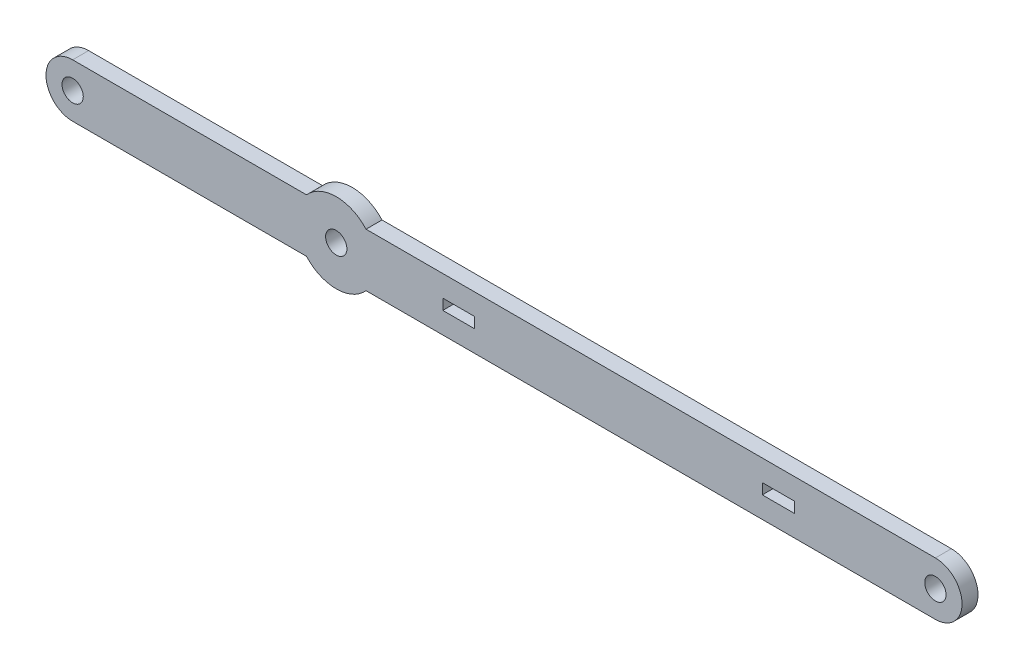
ISO-10303-21;
HEADER;
FILE_DESCRIPTION(('STEP AP214'),'2;1');
FILE_NAME('part.step','',(''),(''),'','','');
FILE_SCHEMA(('AUTOMOTIVE_DESIGN { 1 0 10303 214 1 1 1 1 }'));
ENDSEC;
DATA;
#1=APPLICATION_CONTEXT('core data for automotive mechanical design processes');
#2=APPLICATION_PROTOCOL_DEFINITION('international standard','automotive_design',2000,#1);
#3=PRODUCT_CONTEXT('',#1,'mechanical');
#4=PRODUCT('Part','Part','',(#3));
#5=PRODUCT_RELATED_PRODUCT_CATEGORY('part','',(#4));
#6=PRODUCT_DEFINITION_FORMATION('','',#4);
#7=PRODUCT_DEFINITION_CONTEXT('part definition',#1,'design');
#8=PRODUCT_DEFINITION('design','',#6,#7);
#9=PRODUCT_DEFINITION_SHAPE('','',#8);
#10=(LENGTH_UNIT() NAMED_UNIT(*) SI_UNIT(.MILLI.,.METRE.));
#11=(NAMED_UNIT(*) PLANE_ANGLE_UNIT() SI_UNIT($,.RADIAN.));
#12=(NAMED_UNIT(*) SI_UNIT($,.STERADIAN.) SOLID_ANGLE_UNIT());
#13=UNCERTAINTY_MEASURE_WITH_UNIT(LENGTH_MEASURE(1.E-05),#10,'distance_accuracy_value','');
#14=(GEOMETRIC_REPRESENTATION_CONTEXT(3) GLOBAL_UNCERTAINTY_ASSIGNED_CONTEXT((#13)) GLOBAL_UNIT_ASSIGNED_CONTEXT((#10,
#11,#12)) REPRESENTATION_CONTEXT('',''));
#15=CARTESIAN_POINT('',(0.,0.,0.));
#16=DIRECTION('',(0.,0.,1.));
#17=DIRECTION('',(1.,0.,0.));
#18=AXIS2_PLACEMENT_3D('',#15,#16,#17);
#19=CARTESIAN_POINT('',(0.,0.,1.5));
#20=DIRECTION('',(0.,0.,1.));
#21=DIRECTION('',(1.,0.,0.));
#22=AXIS2_PLACEMENT_3D('',#19,#20,#21);
#23=PLANE('',#22);
#24=CARTESIAN_POINT('',(0.,0.,1.5));
#25=DIRECTION('',(0.,0.,1.));
#26=DIRECTION('',(1.,0.,0.));
#27=AXIS2_PLACEMENT_3D('',#24,#25,#26);
#28=CIRCLE('',#27,2.);
#29=CARTESIAN_POINT('',(2.,0.,1.5));
#30=VERTEX_POINT('',#29);
#31=EDGE_CURVE('E220',#30,#30,#28,.T.);
#32=ORIENTED_EDGE('',*,*,#31,.F.);
#33=EDGE_LOOP('',(#32));
#34=FACE_BOUND('',#33,.T.);
#35=CARTESIAN_POINT('',(0.,0.,1.5));
#36=DIRECTION('',(0.,0.,1.));
#37=DIRECTION('',(1.,0.,0.));
#38=AXIS2_PLACEMENT_3D('',#35,#36,#37);
#39=CIRCLE('',#38,5.);
#40=CARTESIAN_POINT('',(0.,5.,1.5));
#41=VERTEX_POINT('',#40);
#42=CARTESIAN_POINT('',(0.,-5.,1.5));
#43=VERTEX_POINT('',#42);
#44=EDGE_CURVE('E232',#41,#43,#39,.T.);
#45=ORIENTED_EDGE('',*,*,#44,.T.);
#46=DIRECTION('',(1.,0.,0.));
#47=VECTOR('',#46,1.);
#48=CARTESIAN_POINT('',(0.,-5.,1.5));
#49=LINE('',#48,#47);
#50=CARTESIAN_POINT('',(43.9098300562505,-5.,1.5));
#51=VERTEX_POINT('',#50);
#52=EDGE_CURVE('E235',#43,#51,#49,.T.);
#53=ORIENTED_EDGE('',*,*,#52,.T.);
#54=CARTESIAN_POINT('',(49.5,0.,1.5));
#55=DIRECTION('',(0.,0.,1.));
#56=DIRECTION('',(1.,0.,0.));
#57=AXIS2_PLACEMENT_3D('',#54,#55,#56);
#58=CIRCLE('',#57,7.5);
#59=CARTESIAN_POINT('',(55.0901699437495,-5.,1.5));
#60=VERTEX_POINT('',#59);
#61=EDGE_CURVE('E238',#51,#60,#58,.T.);
#62=ORIENTED_EDGE('',*,*,#61,.T.);
#63=DIRECTION('',(1.,0.,0.));
#64=VECTOR('',#63,1.);
#65=CARTESIAN_POINT('',(55.0901699437495,-5.,1.5));
#66=LINE('',#65,#64);
#67=CARTESIAN_POINT('',(162.,-5.,1.5));
#68=VERTEX_POINT('',#67);
#69=EDGE_CURVE('E240',#60,#68,#66,.T.);
#70=ORIENTED_EDGE('',*,*,#69,.T.);
#71=CARTESIAN_POINT('',(162.,0.,1.5));
#72=DIRECTION('',(0.,0.,1.));
#73=DIRECTION('',(1.,0.,0.));
#74=AXIS2_PLACEMENT_3D('',#71,#72,#73);
#75=CIRCLE('',#74,5.);
#76=CARTESIAN_POINT('',(162.,5.,1.5));
#77=VERTEX_POINT('',#76);
#78=EDGE_CURVE('E242',#68,#77,#75,.T.);
#79=ORIENTED_EDGE('',*,*,#78,.T.);
#80=DIRECTION('',(-1.,0.,0.));
#81=VECTOR('',#80,1.);
#82=CARTESIAN_POINT('',(55.0901699437495,5.,1.5));
#83=LINE('',#82,#81);
#84=CARTESIAN_POINT('',(55.0901699437495,5.,1.5));
#85=VERTEX_POINT('',#84);
#86=EDGE_CURVE('E244',#77,#85,#83,.T.);
#87=ORIENTED_EDGE('',*,*,#86,.T.);
#88=CARTESIAN_POINT('',(49.5,0.,1.5));
#89=DIRECTION('',(0.,0.,1.));
#90=DIRECTION('',(1.,0.,0.));
#91=AXIS2_PLACEMENT_3D('',#88,#89,#90);
#92=CIRCLE('',#91,7.5);
#93=CARTESIAN_POINT('',(43.9098300562505,5.,1.5));
#94=VERTEX_POINT('',#93);
#95=EDGE_CURVE('E246',#85,#94,#92,.T.);
#96=ORIENTED_EDGE('',*,*,#95,.T.);
#97=DIRECTION('',(-1.,0.,0.));
#98=VECTOR('',#97,1.);
#99=CARTESIAN_POINT('',(0.,5.,1.5));
#100=LINE('',#99,#98);
#101=EDGE_CURVE('E248',#94,#41,#100,.T.);
#102=ORIENTED_EDGE('',*,*,#101,.T.);
#103=EDGE_LOOP('',(#45,#53,#62,#70,#79,#87,#96,#102));
#104=FACE_BOUND('',#103,.T.);
#105=CARTESIAN_POINT('',(162.,0.,1.5));
#106=DIRECTION('',(0.,0.,1.));
#107=DIRECTION('',(1.,0.,0.));
#108=AXIS2_PLACEMENT_3D('',#105,#106,#107);
#109=CIRCLE('',#108,2.);
#110=CARTESIAN_POINT('',(164.,0.,1.5));
#111=VERTEX_POINT('',#110);
#112=EDGE_CURVE('E226',#111,#111,#109,.T.);
#113=ORIENTED_EDGE('',*,*,#112,.F.);
#114=EDGE_LOOP('',(#113));
#115=FACE_BOUND('',#114,.T.);
#116=CARTESIAN_POINT('',(49.5,0.,1.5));
#117=DIRECTION('',(0.,0.,1.));
#118=DIRECTION('',(1.,0.,0.));
#119=AXIS2_PLACEMENT_3D('',#116,#117,#118);
#120=CIRCLE('',#119,2.);
#121=CARTESIAN_POINT('',(51.5,0.,1.5));
#122=VERTEX_POINT('',#121);
#123=EDGE_CURVE('E214',#122,#122,#120,.T.);
#124=ORIENTED_EDGE('',*,*,#123,.F.);
#125=EDGE_LOOP('',(#124));
#126=FACE_BOUND('',#125,.T.);
#127=DIRECTION('',(0.,-1.,0.));
#128=VECTOR('',#127,1.);
#129=CARTESIAN_POINT('',(129.5,1.,1.5));
#130=LINE('',#129,#128);
#131=CARTESIAN_POINT('',(129.5,1.,1.5));
#132=VERTEX_POINT('',#131);
#133=CARTESIAN_POINT('',(129.5,-1.,1.5));
#134=VERTEX_POINT('',#133);
#135=EDGE_CURVE('E185',#132,#134,#130,.T.);
#136=ORIENTED_EDGE('',*,*,#135,.F.);
#137=DIRECTION('',(-1.,0.,0.));
#138=VECTOR('',#137,1.);
#139=CARTESIAN_POINT('',(135.5,1.,1.5));
#140=LINE('',#139,#138);
#141=CARTESIAN_POINT('',(135.5,1.,1.5));
#142=VERTEX_POINT('',#141);
#143=EDGE_CURVE('E183',#142,#132,#140,.T.);
#144=ORIENTED_EDGE('',*,*,#143,.F.);
#145=DIRECTION('',(0.,1.,0.));
#146=VECTOR('',#145,1.);
#147=CARTESIAN_POINT('',(135.5,-1.,1.5));
#148=LINE('',#147,#146);
#149=CARTESIAN_POINT('',(135.5,-1.,1.5));
#150=VERTEX_POINT('',#149);
#151=EDGE_CURVE('E191',#150,#142,#148,.T.);
#152=ORIENTED_EDGE('',*,*,#151,.F.);
#153=DIRECTION('',(1.,0.,0.));
#154=VECTOR('',#153,1.);
#155=CARTESIAN_POINT('',(129.5,-1.,1.5));
#156=LINE('',#155,#154);
#157=EDGE_CURVE('E188',#134,#150,#156,.T.);
#158=ORIENTED_EDGE('',*,*,#157,.F.);
#159=EDGE_LOOP('',(#136,#144,#152,#158));
#160=FACE_BOUND('',#159,.T.);
#161=DIRECTION('',(-1.,0.,0.));
#162=VECTOR('',#161,1.);
#163=CARTESIAN_POINT('',(75.5,1.,1.5));
#164=LINE('',#163,#162);
#165=CARTESIAN_POINT('',(75.5,1.,1.5));
#166=VERTEX_POINT('',#165);
#167=CARTESIAN_POINT('',(69.5,1.,1.5));
#168=VERTEX_POINT('',#167);
#169=EDGE_CURVE('E155',#166,#168,#164,.T.);
#170=ORIENTED_EDGE('',*,*,#169,.F.);
#171=DIRECTION('',(0.,1.,0.));
#172=VECTOR('',#171,1.);
#173=CARTESIAN_POINT('',(75.5,-1.,1.5));
#174=LINE('',#173,#172);
#175=CARTESIAN_POINT('',(75.5,-1.,1.5));
#176=VERTEX_POINT('',#175);
#177=EDGE_CURVE('E147',#176,#166,#174,.T.);
#178=ORIENTED_EDGE('',*,*,#177,.F.);
#179=DIRECTION('',(1.,0.,0.));
#180=VECTOR('',#179,1.);
#181=CARTESIAN_POINT('',(69.5,-1.,1.5));
#182=LINE('',#181,#180);
#183=CARTESIAN_POINT('',(69.5,-1.,1.5));
#184=VERTEX_POINT('',#183);
#185=EDGE_CURVE('E169',#184,#176,#182,.T.);
#186=ORIENTED_EDGE('',*,*,#185,.F.);
#187=DIRECTION('',(0.,-1.,0.));
#188=VECTOR('',#187,1.);
#189=CARTESIAN_POINT('',(69.5,1.,1.5));
#190=LINE('',#189,#188);
#191=EDGE_CURVE('E167',#168,#184,#190,.T.);
#192=ORIENTED_EDGE('',*,*,#191,.F.);
#193=EDGE_LOOP('',(#170,#178,#186,#192));
#194=FACE_BOUND('',#193,.T.);
#195=ADVANCED_FACE('F34',(#34,#104,#115,#126,#160,#194),#23,.T.);
#196=CARTESIAN_POINT('',(0.,0.,-1.5));
#197=DIRECTION('',(0.,0.,1.));
#198=DIRECTION('',(1.,0.,0.));
#199=AXIS2_PLACEMENT_3D('',#196,#197,#198);
#200=PLANE('',#199);
#201=DIRECTION('',(-1.,0.,0.));
#202=VECTOR('',#201,1.);
#203=CARTESIAN_POINT('',(135.5,1.,-1.5));
#204=LINE('',#203,#202);
#205=CARTESIAN_POINT('',(135.5,1.,-1.5));
#206=VERTEX_POINT('',#205);
#207=CARTESIAN_POINT('',(129.5,1.,-1.5));
#208=VERTEX_POINT('',#207);
#209=EDGE_CURVE('E163',#206,#208,#204,.T.);
#210=ORIENTED_EDGE('',*,*,#209,.T.);
#211=DIRECTION('',(0.,-1.,0.));
#212=VECTOR('',#211,1.);
#213=CARTESIAN_POINT('',(129.5,1.,-1.5));
#214=LINE('',#213,#212);
#215=CARTESIAN_POINT('',(129.5,-1.,-1.5));
#216=VERTEX_POINT('',#215);
#217=EDGE_CURVE('E196',#208,#216,#214,.T.);
#218=ORIENTED_EDGE('',*,*,#217,.T.);
#219=DIRECTION('',(1.,0.,0.));
#220=VECTOR('',#219,1.);
#221=CARTESIAN_POINT('',(129.5,-1.,-1.5));
#222=LINE('',#221,#220);
#223=CARTESIAN_POINT('',(135.5,-1.,-1.5));
#224=VERTEX_POINT('',#223);
#225=EDGE_CURVE('E199',#216,#224,#222,.T.);
#226=ORIENTED_EDGE('',*,*,#225,.T.);
#227=DIRECTION('',(0.,1.,0.));
#228=VECTOR('',#227,1.);
#229=CARTESIAN_POINT('',(135.5,-1.,-1.5));
#230=LINE('',#229,#228);
#231=EDGE_CURVE('E186',#224,#206,#230,.T.);
#232=ORIENTED_EDGE('',*,*,#231,.T.);
#233=EDGE_LOOP('',(#210,#218,#226,#232));
#234=FACE_BOUND('',#233,.T.);
#235=CARTESIAN_POINT('',(0.,0.,-1.5));
#236=DIRECTION('',(0.,0.,1.));
#237=DIRECTION('',(1.,0.,0.));
#238=AXIS2_PLACEMENT_3D('',#235,#236,#237);
#239=CIRCLE('',#238,5.);
#240=CARTESIAN_POINT('',(0.,5.,-1.5));
#241=VERTEX_POINT('',#240);
#242=CARTESIAN_POINT('',(0.,-5.,-1.5));
#243=VERTEX_POINT('',#242);
#244=EDGE_CURVE('E229',#241,#243,#239,.T.);
#245=ORIENTED_EDGE('',*,*,#244,.F.);
#246=DIRECTION('',(-1.,0.,0.));
#247=VECTOR('',#246,1.);
#248=CARTESIAN_POINT('',(0.,5.,-1.5));
#249=LINE('',#248,#247);
#250=CARTESIAN_POINT('',(43.9098300562505,5.,-1.5));
#251=VERTEX_POINT('',#250);
#252=EDGE_CURVE('E236',#251,#241,#249,.T.);
#253=ORIENTED_EDGE('',*,*,#252,.F.);
#254=CARTESIAN_POINT('',(49.5,0.,-1.5));
#255=DIRECTION('',(0.,0.,1.));
#256=DIRECTION('',(1.,0.,0.));
#257=AXIS2_PLACEMENT_3D('',#254,#255,#256);
#258=CIRCLE('',#257,7.5);
#259=CARTESIAN_POINT('',(55.0901699437495,5.,-1.5));
#260=VERTEX_POINT('',#259);
#261=EDGE_CURVE('E263',#260,#251,#258,.T.);
#262=ORIENTED_EDGE('',*,*,#261,.F.);
#263=DIRECTION('',(-1.,0.,0.));
#264=VECTOR('',#263,1.);
#265=CARTESIAN_POINT('',(55.0901699437495,5.,-1.5));
#266=LINE('',#265,#264);
#267=CARTESIAN_POINT('',(162.,5.,-1.5));
#268=VERTEX_POINT('',#267);
#269=EDGE_CURVE('E261',#268,#260,#266,.T.);
#270=ORIENTED_EDGE('',*,*,#269,.F.);
#271=CARTESIAN_POINT('',(162.,0.,-1.5));
#272=DIRECTION('',(0.,0.,1.));
#273=DIRECTION('',(1.,0.,0.));
#274=AXIS2_PLACEMENT_3D('',#271,#272,#273);
#275=CIRCLE('',#274,5.);
#276=CARTESIAN_POINT('',(162.,-5.,-1.5));
#277=VERTEX_POINT('',#276);
#278=EDGE_CURVE('E259',#277,#268,#275,.T.);
#279=ORIENTED_EDGE('',*,*,#278,.F.);
#280=DIRECTION('',(1.,0.,0.));
#281=VECTOR('',#280,1.);
#282=CARTESIAN_POINT('',(55.0901699437495,-5.,-1.5));
#283=LINE('',#282,#281);
#284=CARTESIAN_POINT('',(55.0901699437495,-5.,-1.5));
#285=VERTEX_POINT('',#284);
#286=EDGE_CURVE('E257',#285,#277,#283,.T.);
#287=ORIENTED_EDGE('',*,*,#286,.F.);
#288=CARTESIAN_POINT('',(49.5,0.,-1.5));
#289=DIRECTION('',(0.,0.,1.));
#290=DIRECTION('',(1.,0.,0.));
#291=AXIS2_PLACEMENT_3D('',#288,#289,#290);
#292=CIRCLE('',#291,7.5);
#293=CARTESIAN_POINT('',(43.9098300562505,-5.,-1.5));
#294=VERTEX_POINT('',#293);
#295=EDGE_CURVE('E255',#294,#285,#292,.T.);
#296=ORIENTED_EDGE('',*,*,#295,.F.);
#297=DIRECTION('',(1.,0.,0.));
#298=VECTOR('',#297,1.);
#299=CARTESIAN_POINT('',(0.,-5.,-1.5));
#300=LINE('',#299,#298);
#301=EDGE_CURVE('E253',#243,#294,#300,.T.);
#302=ORIENTED_EDGE('',*,*,#301,.F.);
#303=EDGE_LOOP('',(#245,#253,#262,#270,#279,#287,#296,#302));
#304=FACE_BOUND('',#303,.T.);
#305=CARTESIAN_POINT('',(162.,0.,-1.5));
#306=DIRECTION('',(0.,0.,1.));
#307=DIRECTION('',(1.,0.,0.));
#308=AXIS2_PLACEMENT_3D('',#305,#306,#307);
#309=CIRCLE('',#308,2.);
#310=CARTESIAN_POINT('',(164.,0.,-1.5));
#311=VERTEX_POINT('',#310);
#312=EDGE_CURVE('E223',#311,#311,#309,.T.);
#313=ORIENTED_EDGE('',*,*,#312,.T.);
#314=EDGE_LOOP('',(#313));
#315=FACE_BOUND('',#314,.T.);
#316=CARTESIAN_POINT('',(0.,0.,-1.5));
#317=DIRECTION('',(0.,0.,1.));
#318=DIRECTION('',(1.,0.,0.));
#319=AXIS2_PLACEMENT_3D('',#316,#317,#318);
#320=CIRCLE('',#319,2.);
#321=CARTESIAN_POINT('',(2.,0.,-1.5));
#322=VERTEX_POINT('',#321);
#323=EDGE_CURVE('E217',#322,#322,#320,.T.);
#324=ORIENTED_EDGE('',*,*,#323,.T.);
#325=EDGE_LOOP('',(#324));
#326=FACE_BOUND('',#325,.T.);
#327=CARTESIAN_POINT('',(49.5,0.,-1.5));
#328=DIRECTION('',(0.,0.,1.));
#329=DIRECTION('',(1.,0.,0.));
#330=AXIS2_PLACEMENT_3D('',#327,#328,#329);
#331=CIRCLE('',#330,2.);
#332=CARTESIAN_POINT('',(51.5,0.,-1.5));
#333=VERTEX_POINT('',#332);
#334=EDGE_CURVE('E213',#333,#333,#331,.T.);
#335=ORIENTED_EDGE('',*,*,#334,.T.);
#336=EDGE_LOOP('',(#335));
#337=FACE_BOUND('',#336,.T.);
#338=DIRECTION('',(0.,1.,0.));
#339=VECTOR('',#338,1.);
#340=CARTESIAN_POINT('',(75.5,-1.,-1.5));
#341=LINE('',#340,#339);
#342=CARTESIAN_POINT('',(75.5,-1.,-1.5));
#343=VERTEX_POINT('',#342);
#344=CARTESIAN_POINT('',(75.5,1.,-1.5));
#345=VERTEX_POINT('',#344);
#346=EDGE_CURVE('E57',#343,#345,#341,.T.);
#347=ORIENTED_EDGE('',*,*,#346,.T.);
#348=DIRECTION('',(-1.,0.,0.));
#349=VECTOR('',#348,1.);
#350=CARTESIAN_POINT('',(75.5,1.,-1.5));
#351=LINE('',#350,#349);
#352=CARTESIAN_POINT('',(69.5,1.,-1.5));
#353=VERTEX_POINT('',#352);
#354=EDGE_CURVE('E162',#345,#353,#351,.T.);
#355=ORIENTED_EDGE('',*,*,#354,.T.);
#356=DIRECTION('',(0.,-1.,0.));
#357=VECTOR('',#356,1.);
#358=CARTESIAN_POINT('',(69.5,1.,-1.5));
#359=LINE('',#358,#357);
#360=CARTESIAN_POINT('',(69.5,-1.,-1.5));
#361=VERTEX_POINT('',#360);
#362=EDGE_CURVE('E175',#353,#361,#359,.T.);
#363=ORIENTED_EDGE('',*,*,#362,.T.);
#364=DIRECTION('',(1.,0.,0.));
#365=VECTOR('',#364,1.);
#366=CARTESIAN_POINT('',(69.5,-1.,-1.5));
#367=LINE('',#366,#365);
#368=EDGE_CURVE('E156',#361,#343,#367,.T.);
#369=ORIENTED_EDGE('',*,*,#368,.T.);
#370=EDGE_LOOP('',(#347,#355,#363,#369));
#371=FACE_BOUND('',#370,.T.);
#372=ADVANCED_FACE('F293',(#234,#304,#315,#326,#337,#371),#200,.F.);
#373=CARTESIAN_POINT('',(0.,0.,1.5));
#374=DIRECTION('',(0.,0.,-1.));
#375=DIRECTION('',(-1.,0.,0.));
#376=AXIS2_PLACEMENT_3D('',#373,#374,#375);
#377=CYLINDRICAL_SURFACE('',#376,5.);
#378=ORIENTED_EDGE('',*,*,#244,.T.);
#379=DIRECTION('',(0.,0.,-1.));
#380=VECTOR('',#379,1.);
#381=CARTESIAN_POINT('',(0.,-5.,1.5));
#382=LINE('',#381,#380);
#383=EDGE_CURVE('E11',#43,#243,#382,.T.);
#384=ORIENTED_EDGE('',*,*,#383,.F.);
#385=ORIENTED_EDGE('',*,*,#44,.F.);
#386=DIRECTION('',(0.,0.,-1.));
#387=VECTOR('',#386,1.);
#388=CARTESIAN_POINT('',(0.,5.,1.5));
#389=LINE('',#388,#387);
#390=EDGE_CURVE('E250',#41,#241,#389,.T.);
#391=ORIENTED_EDGE('',*,*,#390,.T.);
#392=EDGE_LOOP('',(#378,#384,#385,#391));
#393=FACE_BOUND('',#392,.T.);
#394=ADVANCED_FACE('F36',(#393),#377,.T.);
#395=CARTESIAN_POINT('',(0.,-5.,1.5));
#396=DIRECTION('',(0.,1.,0.));
#397=DIRECTION('',(0.,0.,1.));
#398=AXIS2_PLACEMENT_3D('',#395,#396,#397);
#399=PLANE('',#398);
#400=ORIENTED_EDGE('',*,*,#301,.T.);
#401=DIRECTION('',(0.,0.,-1.));
#402=VECTOR('',#401,1.);
#403=CARTESIAN_POINT('',(43.9098300562505,-5.,1.5));
#404=LINE('',#403,#402);
#405=EDGE_CURVE('E42',#51,#294,#404,.T.);
#406=ORIENTED_EDGE('',*,*,#405,.F.);
#407=ORIENTED_EDGE('',*,*,#52,.F.);
#408=ORIENTED_EDGE('',*,*,#383,.T.);
#409=EDGE_LOOP('',(#400,#406,#407,#408));
#410=FACE_BOUND('',#409,.T.);
#411=ADVANCED_FACE('F311',(#410),#399,.F.);
#412=CARTESIAN_POINT('',(49.5,0.,1.5));
#413=DIRECTION('',(0.,0.,-1.));
#414=DIRECTION('',(-1.,0.,0.));
#415=AXIS2_PLACEMENT_3D('',#412,#413,#414);
#416=CYLINDRICAL_SURFACE('',#415,7.5);
#417=ORIENTED_EDGE('',*,*,#295,.T.);
#418=DIRECTION('',(0.,0.,-1.));
#419=VECTOR('',#418,1.);
#420=CARTESIAN_POINT('',(55.0901699437495,-5.,1.5));
#421=LINE('',#420,#419);
#422=EDGE_CURVE('E280',#60,#285,#421,.T.);
#423=ORIENTED_EDGE('',*,*,#422,.F.);
#424=ORIENTED_EDGE('',*,*,#61,.F.);
#425=ORIENTED_EDGE('',*,*,#405,.T.);
#426=EDGE_LOOP('',(#417,#423,#424,#425));
#427=FACE_BOUND('',#426,.T.);
#428=ADVANCED_FACE('F287',(#427),#416,.T.);
#429=CARTESIAN_POINT('',(55.0901699437495,-5.,1.5));
#430=DIRECTION('',(0.,1.,0.));
#431=DIRECTION('',(0.,0.,1.));
#432=AXIS2_PLACEMENT_3D('',#429,#430,#431);
#433=PLANE('',#432);
#434=ORIENTED_EDGE('',*,*,#286,.T.);
#435=DIRECTION('',(0.,0.,-1.));
#436=VECTOR('',#435,1.);
#437=CARTESIAN_POINT('',(162.,-5.,1.5));
#438=LINE('',#437,#436);
#439=EDGE_CURVE('E277',#68,#277,#438,.T.);
#440=ORIENTED_EDGE('',*,*,#439,.F.);
#441=ORIENTED_EDGE('',*,*,#69,.F.);
#442=ORIENTED_EDGE('',*,*,#422,.T.);
#443=EDGE_LOOP('',(#434,#440,#441,#442));
#444=FACE_BOUND('',#443,.T.);
#445=ADVANCED_FACE('F299',(#444),#433,.F.);
#446=CARTESIAN_POINT('',(162.,0.,1.5));
#447=DIRECTION('',(0.,0.,-1.));
#448=DIRECTION('',(-1.,0.,0.));
#449=AXIS2_PLACEMENT_3D('',#446,#447,#448);
#450=CYLINDRICAL_SURFACE('',#449,5.);
#451=ORIENTED_EDGE('',*,*,#278,.T.);
#452=DIRECTION('',(0.,0.,-1.));
#453=VECTOR('',#452,1.);
#454=CARTESIAN_POINT('',(162.,5.,1.5));
#455=LINE('',#454,#453);
#456=EDGE_CURVE('E274',#77,#268,#455,.T.);
#457=ORIENTED_EDGE('',*,*,#456,.F.);
#458=ORIENTED_EDGE('',*,*,#78,.F.);
#459=ORIENTED_EDGE('',*,*,#439,.T.);
#460=EDGE_LOOP('',(#451,#457,#458,#459));
#461=FACE_BOUND('',#460,.T.);
#462=ADVANCED_FACE('F303',(#461),#450,.T.);
#463=CARTESIAN_POINT('',(55.0901699437495,5.,1.5));
#464=DIRECTION('',(0.,-1.,0.));
#465=DIRECTION('',(0.,0.,-1.));
#466=AXIS2_PLACEMENT_3D('',#463,#464,#465);
#467=PLANE('',#466);
#468=ORIENTED_EDGE('',*,*,#269,.T.);
#469=DIRECTION('',(0.,0.,-1.));
#470=VECTOR('',#469,1.);
#471=CARTESIAN_POINT('',(55.0901699437495,5.,1.5));
#472=LINE('',#471,#470);
#473=EDGE_CURVE('E271',#85,#260,#472,.T.);
#474=ORIENTED_EDGE('',*,*,#473,.F.);
#475=ORIENTED_EDGE('',*,*,#86,.F.);
#476=ORIENTED_EDGE('',*,*,#456,.T.);
#477=EDGE_LOOP('',(#468,#474,#475,#476));
#478=FACE_BOUND('',#477,.T.);
#479=ADVANCED_FACE('F324',(#478),#467,.F.);
#480=CARTESIAN_POINT('',(49.5,0.,1.5));
#481=DIRECTION('',(0.,0.,-1.));
#482=DIRECTION('',(-1.,0.,0.));
#483=AXIS2_PLACEMENT_3D('',#480,#481,#482);
#484=CYLINDRICAL_SURFACE('',#483,7.5);
#485=ORIENTED_EDGE('',*,*,#261,.T.);
#486=DIRECTION('',(0.,0.,-1.));
#487=VECTOR('',#486,1.);
#488=CARTESIAN_POINT('',(43.9098300562505,5.,1.5));
#489=LINE('',#488,#487);
#490=EDGE_CURVE('E268',#94,#251,#489,.T.);
#491=ORIENTED_EDGE('',*,*,#490,.F.);
#492=ORIENTED_EDGE('',*,*,#95,.F.);
#493=ORIENTED_EDGE('',*,*,#473,.T.);
#494=EDGE_LOOP('',(#485,#491,#492,#493));
#495=FACE_BOUND('',#494,.T.);
#496=ADVANCED_FACE('F322',(#495),#484,.T.);
#497=CARTESIAN_POINT('',(0.,5.,1.5));
#498=DIRECTION('',(0.,-1.,0.));
#499=DIRECTION('',(0.,0.,-1.));
#500=AXIS2_PLACEMENT_3D('',#497,#498,#499);
#501=PLANE('',#500);
#502=ORIENTED_EDGE('',*,*,#252,.T.);
#503=ORIENTED_EDGE('',*,*,#390,.F.);
#504=ORIENTED_EDGE('',*,*,#101,.F.);
#505=ORIENTED_EDGE('',*,*,#490,.T.);
#506=EDGE_LOOP('',(#502,#503,#504,#505));
#507=FACE_BOUND('',#506,.T.);
#508=ADVANCED_FACE('F317',(#507),#501,.F.);
#509=CARTESIAN_POINT('',(162.,0.,1.5));
#510=DIRECTION('',(0.,0.,-1.));
#511=DIRECTION('',(-1.,0.,0.));
#512=AXIS2_PLACEMENT_3D('',#509,#510,#511);
#513=CYLINDRICAL_SURFACE('',#512,2.);
#514=ORIENTED_EDGE('',*,*,#112,.T.);
#515=EDGE_LOOP('',(#514));
#516=FACE_BOUND('',#515,.T.);
#517=ORIENTED_EDGE('',*,*,#312,.F.);
#518=EDGE_LOOP('',(#517));
#519=FACE_BOUND('',#518,.T.);
#520=ADVANCED_FACE('F343',(#516,#519),#513,.F.);
#521=CARTESIAN_POINT('',(0.,0.,1.5));
#522=DIRECTION('',(0.,0.,-1.));
#523=DIRECTION('',(-1.,0.,0.));
#524=AXIS2_PLACEMENT_3D('',#521,#522,#523);
#525=CYLINDRICAL_SURFACE('',#524,2.);
#526=ORIENTED_EDGE('',*,*,#31,.T.);
#527=EDGE_LOOP('',(#526));
#528=FACE_BOUND('',#527,.T.);
#529=ORIENTED_EDGE('',*,*,#323,.F.);
#530=EDGE_LOOP('',(#529));
#531=FACE_BOUND('',#530,.T.);
#532=ADVANCED_FACE('F350',(#528,#531),#525,.F.);
#533=CARTESIAN_POINT('',(49.5,0.,1.5));
#534=DIRECTION('',(0.,0.,-1.));
#535=DIRECTION('',(-1.,0.,0.));
#536=AXIS2_PLACEMENT_3D('',#533,#534,#535);
#537=CYLINDRICAL_SURFACE('',#536,2.);
#538=ORIENTED_EDGE('',*,*,#123,.T.);
#539=EDGE_LOOP('',(#538));
#540=FACE_BOUND('',#539,.T.);
#541=ORIENTED_EDGE('',*,*,#334,.F.);
#542=EDGE_LOOP('',(#541));
#543=FACE_BOUND('',#542,.T.);
#544=ADVANCED_FACE('F355',(#540,#543),#537,.F.);
#545=CARTESIAN_POINT('',(135.5,1.,1.5));
#546=DIRECTION('',(0.,-1.,0.));
#547=DIRECTION('',(1.,0.,0.));
#548=AXIS2_PLACEMENT_3D('',#545,#546,#547);
#549=PLANE('',#548);
#550=ORIENTED_EDGE('',*,*,#209,.F.);
#551=DIRECTION('',(0.,0.,-1.));
#552=VECTOR('',#551,1.);
#553=CARTESIAN_POINT('',(135.5,1.,1.5));
#554=LINE('',#553,#552);
#555=EDGE_CURVE('E193',#142,#206,#554,.T.);
#556=ORIENTED_EDGE('',*,*,#555,.F.);
#557=ORIENTED_EDGE('',*,*,#143,.T.);
#558=DIRECTION('',(0.,0.,-1.));
#559=VECTOR('',#558,1.);
#560=CARTESIAN_POINT('',(129.5,1.,1.5));
#561=LINE('',#560,#559);
#562=EDGE_CURVE('E210',#132,#208,#561,.T.);
#563=ORIENTED_EDGE('',*,*,#562,.T.);
#564=EDGE_LOOP('',(#550,#556,#557,#563));
#565=FACE_BOUND('',#564,.T.);
#566=ADVANCED_FACE('F391',(#565),#549,.T.);
#567=CARTESIAN_POINT('',(129.5,1.,1.5));
#568=DIRECTION('',(1.,0.,0.));
#569=DIRECTION('',(0.,0.,-1.));
#570=AXIS2_PLACEMENT_3D('',#567,#568,#569);
#571=PLANE('',#570);
#572=ORIENTED_EDGE('',*,*,#217,.F.);
#573=ORIENTED_EDGE('',*,*,#562,.F.);
#574=ORIENTED_EDGE('',*,*,#135,.T.);
#575=DIRECTION('',(0.,0.,-1.));
#576=VECTOR('',#575,1.);
#577=CARTESIAN_POINT('',(129.5,-1.,1.5));
#578=LINE('',#577,#576);
#579=EDGE_CURVE('E208',#134,#216,#578,.T.);
#580=ORIENTED_EDGE('',*,*,#579,.T.);
#581=EDGE_LOOP('',(#572,#573,#574,#580));
#582=FACE_BOUND('',#581,.T.);
#583=ADVANCED_FACE('F387',(#582),#571,.T.);
#584=CARTESIAN_POINT('',(129.5,-1.,1.5));
#585=DIRECTION('',(0.,1.,0.));
#586=DIRECTION('',(0.,0.,1.));
#587=AXIS2_PLACEMENT_3D('',#584,#585,#586);
#588=PLANE('',#587);
#589=ORIENTED_EDGE('',*,*,#225,.F.);
#590=ORIENTED_EDGE('',*,*,#579,.F.);
#591=ORIENTED_EDGE('',*,*,#157,.T.);
#592=DIRECTION('',(0.,0.,-1.));
#593=VECTOR('',#592,1.);
#594=CARTESIAN_POINT('',(135.5,-1.,1.5));
#595=LINE('',#594,#593);
#596=EDGE_CURVE('E206',#150,#224,#595,.T.);
#597=ORIENTED_EDGE('',*,*,#596,.T.);
#598=EDGE_LOOP('',(#589,#590,#591,#597));
#599=FACE_BOUND('',#598,.T.);
#600=ADVANCED_FACE('F383',(#599),#588,.T.);
#601=CARTESIAN_POINT('',(135.5,-1.,1.5));
#602=DIRECTION('',(-1.,0.,0.));
#603=DIRECTION('',(0.,0.,1.));
#604=AXIS2_PLACEMENT_3D('',#601,#602,#603);
#605=PLANE('',#604);
#606=ORIENTED_EDGE('',*,*,#231,.F.);
#607=ORIENTED_EDGE('',*,*,#596,.F.);
#608=ORIENTED_EDGE('',*,*,#151,.T.);
#609=ORIENTED_EDGE('',*,*,#555,.T.);
#610=EDGE_LOOP('',(#606,#607,#608,#609));
#611=FACE_BOUND('',#610,.T.);
#612=ADVANCED_FACE('F380',(#611),#605,.T.);
#613=CARTESIAN_POINT('',(75.5,-1.,1.5));
#614=DIRECTION('',(-1.,0.,0.));
#615=DIRECTION('',(0.,0.,1.));
#616=AXIS2_PLACEMENT_3D('',#613,#614,#615);
#617=PLANE('',#616);
#618=ORIENTED_EDGE('',*,*,#346,.F.);
#619=DIRECTION('',(0.,0.,-1.));
#620=VECTOR('',#619,1.);
#621=CARTESIAN_POINT('',(75.5,-1.,1.5));
#622=LINE('',#621,#620);
#623=EDGE_CURVE('E151',#176,#343,#622,.T.);
#624=ORIENTED_EDGE('',*,*,#623,.F.);
#625=ORIENTED_EDGE('',*,*,#177,.T.);
#626=DIRECTION('',(0.,0.,-1.));
#627=VECTOR('',#626,1.);
#628=CARTESIAN_POINT('',(75.5,1.,1.5));
#629=LINE('',#628,#627);
#630=EDGE_CURVE('E150',#166,#345,#629,.T.);
#631=ORIENTED_EDGE('',*,*,#630,.T.);
#632=EDGE_LOOP('',(#618,#624,#625,#631));
#633=FACE_BOUND('',#632,.T.);
#634=ADVANCED_FACE('F149',(#633),#617,.T.);
#635=CARTESIAN_POINT('',(75.5,1.,1.5));
#636=DIRECTION('',(0.,-1.,0.));
#637=DIRECTION('',(1.,0.,0.));
#638=AXIS2_PLACEMENT_3D('',#635,#636,#637);
#639=PLANE('',#638);
#640=ORIENTED_EDGE('',*,*,#354,.F.);
#641=ORIENTED_EDGE('',*,*,#630,.F.);
#642=ORIENTED_EDGE('',*,*,#169,.T.);
#643=DIRECTION('',(0.,0.,-1.));
#644=VECTOR('',#643,1.);
#645=CARTESIAN_POINT('',(69.5,1.,1.5));
#646=LINE('',#645,#644);
#647=EDGE_CURVE('E164',#168,#353,#646,.T.);
#648=ORIENTED_EDGE('',*,*,#647,.T.);
#649=EDGE_LOOP('',(#640,#641,#642,#648));
#650=FACE_BOUND('',#649,.T.);
#651=ADVANCED_FACE('F159',(#650),#639,.T.);
#652=CARTESIAN_POINT('',(69.5,1.,1.5));
#653=DIRECTION('',(1.,0.,0.));
#654=DIRECTION('',(0.,0.,-1.));
#655=AXIS2_PLACEMENT_3D('',#652,#653,#654);
#656=PLANE('',#655);
#657=ORIENTED_EDGE('',*,*,#362,.F.);
#658=ORIENTED_EDGE('',*,*,#647,.F.);
#659=ORIENTED_EDGE('',*,*,#191,.T.);
#660=DIRECTION('',(0.,0.,-1.));
#661=VECTOR('',#660,1.);
#662=CARTESIAN_POINT('',(69.5,-1.,1.5));
#663=LINE('',#662,#661);
#664=EDGE_CURVE('E49',#184,#361,#663,.T.);
#665=ORIENTED_EDGE('',*,*,#664,.T.);
#666=EDGE_LOOP('',(#657,#658,#659,#665));
#667=FACE_BOUND('',#666,.T.);
#668=ADVANCED_FACE('F368',(#667),#656,.T.);
#669=CARTESIAN_POINT('',(69.5,-1.,1.5));
#670=DIRECTION('',(0.,1.,0.));
#671=DIRECTION('',(0.,0.,1.));
#672=AXIS2_PLACEMENT_3D('',#669,#670,#671);
#673=PLANE('',#672);
#674=ORIENTED_EDGE('',*,*,#368,.F.);
#675=ORIENTED_EDGE('',*,*,#664,.F.);
#676=ORIENTED_EDGE('',*,*,#185,.T.);
#677=ORIENTED_EDGE('',*,*,#623,.T.);
#678=EDGE_LOOP('',(#674,#675,#676,#677));
#679=FACE_BOUND('',#678,.T.);
#680=ADVANCED_FACE('F366',(#679),#673,.T.);
#681=CLOSED_SHELL('',(#195,#372,#394,#411,#428,#445,#462,#479,#496,#508,#520,#532,#544,#566,
#583,#600,#612,#634,#651,#668,#680));
#682=MANIFOLD_SOLID_BREP('B2',#681);
#683=ADVANCED_BREP_SHAPE_REPRESENTATION('',(#18,#682),#14);
#684=SHAPE_DEFINITION_REPRESENTATION(#9,#683);
ENDSEC;
END-ISO-10303-21;
